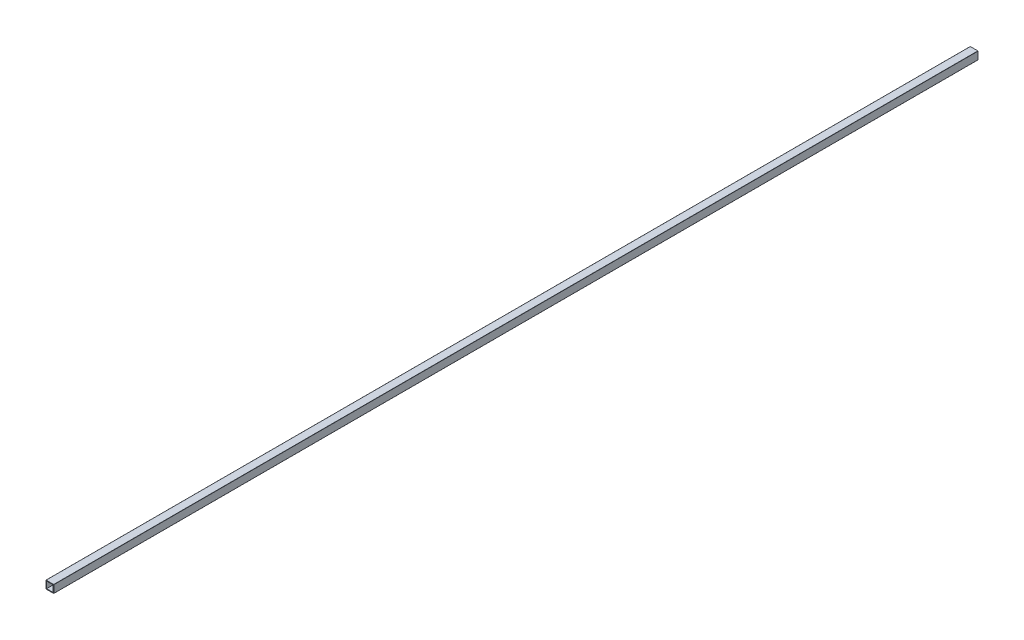
ISO-10303-21;
HEADER;
FILE_DESCRIPTION(('STEP AP214'),'2;1');
FILE_NAME('part.step','',(''),(''),'','','');
FILE_SCHEMA(('AUTOMOTIVE_DESIGN { 1 0 10303 214 1 1 1 1 }'));
ENDSEC;
DATA;
#1=APPLICATION_CONTEXT('core data for automotive mechanical design processes');
#2=APPLICATION_PROTOCOL_DEFINITION('international standard','automotive_design',2000,#1);
#3=PRODUCT_CONTEXT('',#1,'mechanical');
#4=PRODUCT('Part','Part','',(#3));
#5=PRODUCT_RELATED_PRODUCT_CATEGORY('part','',(#4));
#6=PRODUCT_DEFINITION_FORMATION('','',#4);
#7=PRODUCT_DEFINITION_CONTEXT('part definition',#1,'design');
#8=PRODUCT_DEFINITION('design','',#6,#7);
#9=PRODUCT_DEFINITION_SHAPE('','',#8);
#10=(LENGTH_UNIT() NAMED_UNIT(*) SI_UNIT(.MILLI.,.METRE.));
#11=(NAMED_UNIT(*) PLANE_ANGLE_UNIT() SI_UNIT($,.RADIAN.));
#12=(NAMED_UNIT(*) SI_UNIT($,.STERADIAN.) SOLID_ANGLE_UNIT());
#13=UNCERTAINTY_MEASURE_WITH_UNIT(LENGTH_MEASURE(1.E-05),#10,'distance_accuracy_value','');
#14=(GEOMETRIC_REPRESENTATION_CONTEXT(3) GLOBAL_UNCERTAINTY_ASSIGNED_CONTEXT((#13)) GLOBAL_UNIT_ASSIGNED_CONTEXT((#10,
#11,#12)) REPRESENTATION_CONTEXT('',''));
#15=CARTESIAN_POINT('',(0.,0.,0.));
#16=DIRECTION('',(0.,0.,1.));
#17=DIRECTION('',(1.,0.,0.));
#18=AXIS2_PLACEMENT_3D('',#15,#16,#17);
#19=CARTESIAN_POINT('',(24.4,24.4,6000.));
#20=DIRECTION('',(0.,0.,-1.));
#21=DIRECTION('',(-1.,0.,0.));
#22=AXIS2_PLACEMENT_3D('',#19,#20,#21);
#23=PLANE('',#22);
#24=CARTESIAN_POINT('',(24.4,24.4,6000.));
#25=DIRECTION('',(0.,0.,1.));
#26=DIRECTION('',(-1.,0.,0.));
#27=AXIS2_PLACEMENT_3D('',#24,#25,#26);
#28=CIRCLE('',#27,1.);
#29=CARTESIAN_POINT('',(25.4,24.4,6000.));
#30=VERTEX_POINT('',#29);
#31=CARTESIAN_POINT('',(24.4,25.4,6000.));
#32=VERTEX_POINT('',#31);
#33=EDGE_CURVE('E158',#30,#32,#28,.T.);
#34=ORIENTED_EDGE('',*,*,#33,.T.);
#35=DIRECTION('',(-1.,0.,0.));
#36=VECTOR('',#35,1.);
#37=CARTESIAN_POINT('',(-24.4,25.4,6000.));
#38=LINE('',#37,#36);
#39=CARTESIAN_POINT('',(-24.4,25.4,6000.));
#40=VERTEX_POINT('',#39);
#41=EDGE_CURVE('E161',#32,#40,#38,.T.);
#42=ORIENTED_EDGE('',*,*,#41,.T.);
#43=CARTESIAN_POINT('',(-24.4,24.4,6000.));
#44=DIRECTION('',(0.,0.,1.));
#45=DIRECTION('',(-1.,0.,0.));
#46=AXIS2_PLACEMENT_3D('',#43,#44,#45);
#47=CIRCLE('',#46,1.);
#48=CARTESIAN_POINT('',(-25.4,24.4,6000.));
#49=VERTEX_POINT('',#48);
#50=EDGE_CURVE('E164',#40,#49,#47,.T.);
#51=ORIENTED_EDGE('',*,*,#50,.T.);
#52=DIRECTION('',(0.,-1.,0.));
#53=VECTOR('',#52,1.);
#54=CARTESIAN_POINT('',(-25.4,-24.4,6000.));
#55=LINE('',#54,#53);
#56=CARTESIAN_POINT('',(-25.4,-24.4,6000.));
#57=VERTEX_POINT('',#56);
#58=EDGE_CURVE('E166',#49,#57,#55,.T.);
#59=ORIENTED_EDGE('',*,*,#58,.T.);
#60=CARTESIAN_POINT('',(-24.4,-24.4,6000.));
#61=DIRECTION('',(0.,0.,1.));
#62=DIRECTION('',(-1.,0.,0.));
#63=AXIS2_PLACEMENT_3D('',#60,#61,#62);
#64=CIRCLE('',#63,1.);
#65=CARTESIAN_POINT('',(-24.4,-25.4,6000.));
#66=VERTEX_POINT('',#65);
#67=EDGE_CURVE('E168',#57,#66,#64,.T.);
#68=ORIENTED_EDGE('',*,*,#67,.T.);
#69=DIRECTION('',(1.,0.,0.));
#70=VECTOR('',#69,1.);
#71=CARTESIAN_POINT('',(-24.4,-25.4,6000.));
#72=LINE('',#71,#70);
#73=CARTESIAN_POINT('',(24.4,-25.4,6000.));
#74=VERTEX_POINT('',#73);
#75=EDGE_CURVE('E170',#66,#74,#72,.T.);
#76=ORIENTED_EDGE('',*,*,#75,.T.);
#77=CARTESIAN_POINT('',(24.4,-24.4,6000.));
#78=DIRECTION('',(0.,0.,1.));
#79=DIRECTION('',(1.,0.,0.));
#80=AXIS2_PLACEMENT_3D('',#77,#78,#79);
#81=CIRCLE('',#80,1.);
#82=CARTESIAN_POINT('',(25.4,-24.4,6000.));
#83=VERTEX_POINT('',#82);
#84=EDGE_CURVE('E172',#74,#83,#81,.T.);
#85=ORIENTED_EDGE('',*,*,#84,.T.);
#86=DIRECTION('',(0.,1.,0.));
#87=VECTOR('',#86,1.);
#88=CARTESIAN_POINT('',(25.4,-24.4,6000.));
#89=LINE('',#88,#87);
#90=EDGE_CURVE('E174',#83,#30,#89,.T.);
#91=ORIENTED_EDGE('',*,*,#90,.T.);
#92=EDGE_LOOP('',(#34,#42,#51,#59,#68,#76,#85,#91));
#93=FACE_BOUND('',#92,.T.);
#94=DIRECTION('',(1.,0.,0.));
#95=VECTOR('',#94,1.);
#96=CARTESIAN_POINT('',(-21.6,-21.6,6000.));
#97=LINE('',#96,#95);
#98=CARTESIAN_POINT('',(-21.6,-21.6,6000.));
#99=VERTEX_POINT('',#98);
#100=CARTESIAN_POINT('',(21.6,-21.6,6000.));
#101=VERTEX_POINT('',#100);
#102=EDGE_CURVE('E122',#99,#101,#97,.T.);
#103=ORIENTED_EDGE('',*,*,#102,.F.);
#104=DIRECTION('',(0.,-1.,0.));
#105=VECTOR('',#104,1.);
#106=CARTESIAN_POINT('',(-21.6,-21.6,6000.));
#107=LINE('',#106,#105);
#108=CARTESIAN_POINT('',(-21.6,21.6,6000.));
#109=VERTEX_POINT('',#108);
#110=EDGE_CURVE('E144',#109,#99,#107,.T.);
#111=ORIENTED_EDGE('',*,*,#110,.F.);
#112=DIRECTION('',(-1.,0.,0.));
#113=VECTOR('',#112,1.);
#114=CARTESIAN_POINT('',(-21.6,21.6,6000.));
#115=LINE('',#114,#113);
#116=CARTESIAN_POINT('',(21.6,21.6,6000.));
#117=VERTEX_POINT('',#116);
#118=EDGE_CURVE('E142',#117,#109,#115,.T.);
#119=ORIENTED_EDGE('',*,*,#118,.F.);
#120=DIRECTION('',(0.,1.,0.));
#121=VECTOR('',#120,1.);
#122=CARTESIAN_POINT('',(21.6,-21.6,6000.));
#123=LINE('',#122,#121);
#124=EDGE_CURVE('E130',#101,#117,#123,.T.);
#125=ORIENTED_EDGE('',*,*,#124,.F.);
#126=EDGE_LOOP('',(#103,#111,#119,#125));
#127=FACE_BOUND('',#126,.T.);
#128=ADVANCED_FACE('F33',(#93,#127),#23,.F.);
#129=CARTESIAN_POINT('',(24.4,24.4,0.));
#130=DIRECTION('',(0.,0.,-1.));
#131=DIRECTION('',(-1.,0.,0.));
#132=AXIS2_PLACEMENT_3D('',#129,#130,#131);
#133=PLANE('',#132);
#134=CARTESIAN_POINT('',(24.4,24.4,0.));
#135=DIRECTION('',(0.,0.,1.));
#136=DIRECTION('',(-1.,0.,0.));
#137=AXIS2_PLACEMENT_3D('',#134,#135,#136);
#138=CIRCLE('',#137,1.);
#139=CARTESIAN_POINT('',(25.4,24.4,0.));
#140=VERTEX_POINT('',#139);
#141=CARTESIAN_POINT('',(24.4,25.4,0.));
#142=VERTEX_POINT('',#141);
#143=EDGE_CURVE('E138',#140,#142,#138,.T.);
#144=ORIENTED_EDGE('',*,*,#143,.F.);
#145=DIRECTION('',(0.,1.,0.));
#146=VECTOR('',#145,1.);
#147=CARTESIAN_POINT('',(25.4,-24.4,0.));
#148=LINE('',#147,#146);
#149=CARTESIAN_POINT('',(25.4,-24.4,0.));
#150=VERTEX_POINT('',#149);
#151=EDGE_CURVE('E162',#150,#140,#148,.T.);
#152=ORIENTED_EDGE('',*,*,#151,.F.);
#153=CARTESIAN_POINT('',(24.4,-24.4,0.));
#154=DIRECTION('',(0.,0.,1.));
#155=DIRECTION('',(1.,0.,0.));
#156=AXIS2_PLACEMENT_3D('',#153,#154,#155);
#157=CIRCLE('',#156,1.);
#158=CARTESIAN_POINT('',(24.4,-25.4,0.));
#159=VERTEX_POINT('',#158);
#160=EDGE_CURVE('E189',#159,#150,#157,.T.);
#161=ORIENTED_EDGE('',*,*,#160,.F.);
#162=DIRECTION('',(1.,0.,0.));
#163=VECTOR('',#162,1.);
#164=CARTESIAN_POINT('',(-24.4,-25.4,0.));
#165=LINE('',#164,#163);
#166=CARTESIAN_POINT('',(-24.4,-25.4,0.));
#167=VERTEX_POINT('',#166);
#168=EDGE_CURVE('E187',#167,#159,#165,.T.);
#169=ORIENTED_EDGE('',*,*,#168,.F.);
#170=CARTESIAN_POINT('',(-24.4,-24.4,0.));
#171=DIRECTION('',(0.,0.,1.));
#172=DIRECTION('',(-1.,0.,0.));
#173=AXIS2_PLACEMENT_3D('',#170,#171,#172);
#174=CIRCLE('',#173,1.);
#175=CARTESIAN_POINT('',(-25.4,-24.4,0.));
#176=VERTEX_POINT('',#175);
#177=EDGE_CURVE('E185',#176,#167,#174,.T.);
#178=ORIENTED_EDGE('',*,*,#177,.F.);
#179=DIRECTION('',(0.,-1.,0.));
#180=VECTOR('',#179,1.);
#181=CARTESIAN_POINT('',(-25.4,-24.4,0.));
#182=LINE('',#181,#180);
#183=CARTESIAN_POINT('',(-25.4,24.4,0.));
#184=VERTEX_POINT('',#183);
#185=EDGE_CURVE('E183',#184,#176,#182,.T.);
#186=ORIENTED_EDGE('',*,*,#185,.F.);
#187=CARTESIAN_POINT('',(-24.4,24.4,0.));
#188=DIRECTION('',(0.,0.,1.));
#189=DIRECTION('',(-1.,0.,0.));
#190=AXIS2_PLACEMENT_3D('',#187,#188,#189);
#191=CIRCLE('',#190,1.);
#192=CARTESIAN_POINT('',(-24.4,25.4,0.));
#193=VERTEX_POINT('',#192);
#194=EDGE_CURVE('E181',#193,#184,#191,.T.);
#195=ORIENTED_EDGE('',*,*,#194,.F.);
#196=DIRECTION('',(-1.,0.,0.));
#197=VECTOR('',#196,1.);
#198=CARTESIAN_POINT('',(-24.4,25.4,0.));
#199=LINE('',#198,#197);
#200=EDGE_CURVE('E179',#142,#193,#199,.T.);
#201=ORIENTED_EDGE('',*,*,#200,.F.);
#202=EDGE_LOOP('',(#144,#152,#161,#169,#178,#186,#195,#201));
#203=FACE_BOUND('',#202,.T.);
#204=DIRECTION('',(0.,-1.,0.));
#205=VECTOR('',#204,1.);
#206=CARTESIAN_POINT('',(-21.6,-21.6,0.));
#207=LINE('',#206,#205);
#208=CARTESIAN_POINT('',(-21.6,21.6,0.));
#209=VERTEX_POINT('',#208);
#210=CARTESIAN_POINT('',(-21.6,-21.6,0.));
#211=VERTEX_POINT('',#210);
#212=EDGE_CURVE('E131',#209,#211,#207,.T.);
#213=ORIENTED_EDGE('',*,*,#212,.T.);
#214=DIRECTION('',(1.,0.,0.));
#215=VECTOR('',#214,1.);
#216=CARTESIAN_POINT('',(-21.6,-21.6,0.));
#217=LINE('',#216,#215);
#218=CARTESIAN_POINT('',(21.6,-21.6,0.));
#219=VERTEX_POINT('',#218);
#220=EDGE_CURVE('E56',#211,#219,#217,.T.);
#221=ORIENTED_EDGE('',*,*,#220,.T.);
#222=DIRECTION('',(0.,1.,0.));
#223=VECTOR('',#222,1.);
#224=CARTESIAN_POINT('',(21.6,-21.6,0.));
#225=LINE('',#224,#223);
#226=CARTESIAN_POINT('',(21.6,21.6,0.));
#227=VERTEX_POINT('',#226);
#228=EDGE_CURVE('E137',#219,#227,#225,.T.);
#229=ORIENTED_EDGE('',*,*,#228,.T.);
#230=DIRECTION('',(-1.,0.,0.));
#231=VECTOR('',#230,1.);
#232=CARTESIAN_POINT('',(-21.6,21.6,0.));
#233=LINE('',#232,#231);
#234=EDGE_CURVE('E150',#227,#209,#233,.T.);
#235=ORIENTED_EDGE('',*,*,#234,.T.);
#236=EDGE_LOOP('',(#213,#221,#229,#235));
#237=FACE_BOUND('',#236,.T.);
#238=ADVANCED_FACE('F219',(#203,#237),#133,.T.);
#239=CARTESIAN_POINT('',(24.4,24.4,6000.));
#240=DIRECTION('',(0.,0.,-1.));
#241=DIRECTION('',(-1.,0.,0.));
#242=AXIS2_PLACEMENT_3D('',#239,#240,#241);
#243=CYLINDRICAL_SURFACE('',#242,1.);
#244=ORIENTED_EDGE('',*,*,#143,.T.);
#245=DIRECTION('',(0.,0.,-1.));
#246=VECTOR('',#245,1.);
#247=CARTESIAN_POINT('',(24.4,25.4,6000.));
#248=LINE('',#247,#246);
#249=EDGE_CURVE('E11',#32,#142,#248,.T.);
#250=ORIENTED_EDGE('',*,*,#249,.F.);
#251=ORIENTED_EDGE('',*,*,#33,.F.);
#252=DIRECTION('',(0.,0.,-1.));
#253=VECTOR('',#252,1.);
#254=CARTESIAN_POINT('',(25.4,24.4,6000.));
#255=LINE('',#254,#253);
#256=EDGE_CURVE('E176',#30,#140,#255,.T.);
#257=ORIENTED_EDGE('',*,*,#256,.T.);
#258=EDGE_LOOP('',(#244,#250,#251,#257));
#259=FACE_BOUND('',#258,.T.);
#260=ADVANCED_FACE('F35',(#259),#243,.T.);
#261=CARTESIAN_POINT('',(-24.4,25.4,6000.));
#262=DIRECTION('',(0.,-1.,0.));
#263=DIRECTION('',(0.,0.,-1.));
#264=AXIS2_PLACEMENT_3D('',#261,#262,#263);
#265=PLANE('',#264);
#266=ORIENTED_EDGE('',*,*,#200,.T.);
#267=DIRECTION('',(0.,0.,-1.));
#268=VECTOR('',#267,1.);
#269=CARTESIAN_POINT('',(-24.4,25.4,6000.));
#270=LINE('',#269,#268);
#271=EDGE_CURVE('E41',#40,#193,#270,.T.);
#272=ORIENTED_EDGE('',*,*,#271,.F.);
#273=ORIENTED_EDGE('',*,*,#41,.F.);
#274=ORIENTED_EDGE('',*,*,#249,.T.);
#275=EDGE_LOOP('',(#266,#272,#273,#274));
#276=FACE_BOUND('',#275,.T.);
#277=ADVANCED_FACE('F236',(#276),#265,.F.);
#278=CARTESIAN_POINT('',(-24.4,24.4,6000.));
#279=DIRECTION('',(0.,0.,-1.));
#280=DIRECTION('',(-1.,0.,0.));
#281=AXIS2_PLACEMENT_3D('',#278,#279,#280);
#282=CYLINDRICAL_SURFACE('',#281,1.);
#283=ORIENTED_EDGE('',*,*,#194,.T.);
#284=DIRECTION('',(0.,0.,-1.));
#285=VECTOR('',#284,1.);
#286=CARTESIAN_POINT('',(-25.4,24.4,6000.));
#287=LINE('',#286,#285);
#288=EDGE_CURVE('E206',#49,#184,#287,.T.);
#289=ORIENTED_EDGE('',*,*,#288,.F.);
#290=ORIENTED_EDGE('',*,*,#50,.F.);
#291=ORIENTED_EDGE('',*,*,#271,.T.);
#292=EDGE_LOOP('',(#283,#289,#290,#291));
#293=FACE_BOUND('',#292,.T.);
#294=ADVANCED_FACE('F213',(#293),#282,.T.);
#295=CARTESIAN_POINT('',(-25.4,-24.4,6000.));
#296=DIRECTION('',(1.,0.,0.));
#297=DIRECTION('',(0.,0.,-1.));
#298=AXIS2_PLACEMENT_3D('',#295,#296,#297);
#299=PLANE('',#298);
#300=ORIENTED_EDGE('',*,*,#185,.T.);
#301=DIRECTION('',(0.,0.,-1.));
#302=VECTOR('',#301,1.);
#303=CARTESIAN_POINT('',(-25.4,-24.4,6000.));
#304=LINE('',#303,#302);
#305=EDGE_CURVE('E203',#57,#176,#304,.T.);
#306=ORIENTED_EDGE('',*,*,#305,.F.);
#307=ORIENTED_EDGE('',*,*,#58,.F.);
#308=ORIENTED_EDGE('',*,*,#288,.T.);
#309=EDGE_LOOP('',(#300,#306,#307,#308));
#310=FACE_BOUND('',#309,.T.);
#311=ADVANCED_FACE('F225',(#310),#299,.F.);
#312=CARTESIAN_POINT('',(-24.4,-24.4,6000.));
#313=DIRECTION('',(0.,0.,-1.));
#314=DIRECTION('',(-1.,0.,0.));
#315=AXIS2_PLACEMENT_3D('',#312,#313,#314);
#316=CYLINDRICAL_SURFACE('',#315,1.);
#317=ORIENTED_EDGE('',*,*,#177,.T.);
#318=DIRECTION('',(0.,0.,-1.));
#319=VECTOR('',#318,1.);
#320=CARTESIAN_POINT('',(-24.4,-25.4,6000.));
#321=LINE('',#320,#319);
#322=EDGE_CURVE('E200',#66,#167,#321,.T.);
#323=ORIENTED_EDGE('',*,*,#322,.F.);
#324=ORIENTED_EDGE('',*,*,#67,.F.);
#325=ORIENTED_EDGE('',*,*,#305,.T.);
#326=EDGE_LOOP('',(#317,#323,#324,#325));
#327=FACE_BOUND('',#326,.T.);
#328=ADVANCED_FACE('F229',(#327),#316,.T.);
#329=CARTESIAN_POINT('',(-24.4,-25.4,6000.));
#330=DIRECTION('',(0.,1.,0.));
#331=DIRECTION('',(0.,0.,1.));
#332=AXIS2_PLACEMENT_3D('',#329,#330,#331);
#333=PLANE('',#332);
#334=ORIENTED_EDGE('',*,*,#168,.T.);
#335=DIRECTION('',(0.,0.,-1.));
#336=VECTOR('',#335,1.);
#337=CARTESIAN_POINT('',(24.4,-25.4,6000.));
#338=LINE('',#337,#336);
#339=EDGE_CURVE('E197',#74,#159,#338,.T.);
#340=ORIENTED_EDGE('',*,*,#339,.F.);
#341=ORIENTED_EDGE('',*,*,#75,.F.);
#342=ORIENTED_EDGE('',*,*,#322,.T.);
#343=EDGE_LOOP('',(#334,#340,#341,#342));
#344=FACE_BOUND('',#343,.T.);
#345=ADVANCED_FACE('F249',(#344),#333,.F.);
#346=CARTESIAN_POINT('',(24.4,-24.4,6000.));
#347=DIRECTION('',(0.,0.,-1.));
#348=DIRECTION('',(-1.,0.,0.));
#349=AXIS2_PLACEMENT_3D('',#346,#347,#348);
#350=CYLINDRICAL_SURFACE('',#349,1.);
#351=ORIENTED_EDGE('',*,*,#160,.T.);
#352=DIRECTION('',(0.,0.,-1.));
#353=VECTOR('',#352,1.);
#354=CARTESIAN_POINT('',(25.4,-24.4,6000.));
#355=LINE('',#354,#353);
#356=EDGE_CURVE('E194',#83,#150,#355,.T.);
#357=ORIENTED_EDGE('',*,*,#356,.F.);
#358=ORIENTED_EDGE('',*,*,#84,.F.);
#359=ORIENTED_EDGE('',*,*,#339,.T.);
#360=EDGE_LOOP('',(#351,#357,#358,#359));
#361=FACE_BOUND('',#360,.T.);
#362=ADVANCED_FACE('F247',(#361),#350,.T.);
#363=CARTESIAN_POINT('',(25.4,-24.4,6000.));
#364=DIRECTION('',(-1.,0.,0.));
#365=DIRECTION('',(0.,0.,1.));
#366=AXIS2_PLACEMENT_3D('',#363,#364,#365);
#367=PLANE('',#366);
#368=ORIENTED_EDGE('',*,*,#151,.T.);
#369=ORIENTED_EDGE('',*,*,#256,.F.);
#370=ORIENTED_EDGE('',*,*,#90,.F.);
#371=ORIENTED_EDGE('',*,*,#356,.T.);
#372=EDGE_LOOP('',(#368,#369,#370,#371));
#373=FACE_BOUND('',#372,.T.);
#374=ADVANCED_FACE('F242',(#373),#367,.F.);
#375=CARTESIAN_POINT('',(-21.6,-21.6,6000.));
#376=DIRECTION('',(0.,1.,0.));
#377=DIRECTION('',(0.,0.,1.));
#378=AXIS2_PLACEMENT_3D('',#375,#376,#377);
#379=PLANE('',#378);
#380=ORIENTED_EDGE('',*,*,#220,.F.);
#381=DIRECTION('',(0.,0.,-1.));
#382=VECTOR('',#381,1.);
#383=CARTESIAN_POINT('',(-21.6,-21.6,6000.));
#384=LINE('',#383,#382);
#385=EDGE_CURVE('E126',#99,#211,#384,.T.);
#386=ORIENTED_EDGE('',*,*,#385,.F.);
#387=ORIENTED_EDGE('',*,*,#102,.T.);
#388=DIRECTION('',(0.,0.,-1.));
#389=VECTOR('',#388,1.);
#390=CARTESIAN_POINT('',(21.6,-21.6,6000.));
#391=LINE('',#390,#389);
#392=EDGE_CURVE('E125',#101,#219,#391,.T.);
#393=ORIENTED_EDGE('',*,*,#392,.T.);
#394=EDGE_LOOP('',(#380,#386,#387,#393));
#395=FACE_BOUND('',#394,.T.);
#396=ADVANCED_FACE('F124',(#395),#379,.T.);
#397=CARTESIAN_POINT('',(21.6,-21.6,6000.));
#398=DIRECTION('',(-1.,0.,0.));
#399=DIRECTION('',(0.,-1.,0.));
#400=AXIS2_PLACEMENT_3D('',#397,#398,#399);
#401=PLANE('',#400);
#402=ORIENTED_EDGE('',*,*,#228,.F.);
#403=ORIENTED_EDGE('',*,*,#392,.F.);
#404=ORIENTED_EDGE('',*,*,#124,.T.);
#405=DIRECTION('',(0.,0.,-1.));
#406=VECTOR('',#405,1.);
#407=CARTESIAN_POINT('',(21.6,21.6,6000.));
#408=LINE('',#407,#406);
#409=EDGE_CURVE('E139',#117,#227,#408,.T.);
#410=ORIENTED_EDGE('',*,*,#409,.T.);
#411=EDGE_LOOP('',(#402,#403,#404,#410));
#412=FACE_BOUND('',#411,.T.);
#413=ADVANCED_FACE('F134',(#412),#401,.T.);
#414=CARTESIAN_POINT('',(-21.6,21.6,6000.));
#415=DIRECTION('',(0.,-1.,0.));
#416=DIRECTION('',(1.,0.,0.));
#417=AXIS2_PLACEMENT_3D('',#414,#415,#416);
#418=PLANE('',#417);
#419=ORIENTED_EDGE('',*,*,#234,.F.);
#420=ORIENTED_EDGE('',*,*,#409,.F.);
#421=ORIENTED_EDGE('',*,*,#118,.T.);
#422=DIRECTION('',(0.,0.,-1.));
#423=VECTOR('',#422,1.);
#424=CARTESIAN_POINT('',(-21.6,21.6,6000.));
#425=LINE('',#424,#423);
#426=EDGE_CURVE('E48',#109,#209,#425,.T.);
#427=ORIENTED_EDGE('',*,*,#426,.T.);
#428=EDGE_LOOP('',(#419,#420,#421,#427));
#429=FACE_BOUND('',#428,.T.);
#430=ADVANCED_FACE('F274',(#429),#418,.T.);
#431=CARTESIAN_POINT('',(-21.6,-21.6,6000.));
#432=DIRECTION('',(1.,0.,0.));
#433=DIRECTION('',(0.,0.,-1.));
#434=AXIS2_PLACEMENT_3D('',#431,#432,#433);
#435=PLANE('',#434);
#436=ORIENTED_EDGE('',*,*,#212,.F.);
#437=ORIENTED_EDGE('',*,*,#426,.F.);
#438=ORIENTED_EDGE('',*,*,#110,.T.);
#439=ORIENTED_EDGE('',*,*,#385,.T.);
#440=EDGE_LOOP('',(#436,#437,#438,#439));
#441=FACE_BOUND('',#440,.T.);
#442=ADVANCED_FACE('F278',(#441),#435,.T.);
#443=CLOSED_SHELL('',(#128,#238,#260,#277,#294,#311,#328,#345,#362,#374,#396,#413,#430,#442));
#444=MANIFOLD_SOLID_BREP('B2',#443);
#445=ADVANCED_BREP_SHAPE_REPRESENTATION('',(#18,#444),#14);
#446=SHAPE_DEFINITION_REPRESENTATION(#9,#445);
ENDSEC;
END-ISO-10303-21;
